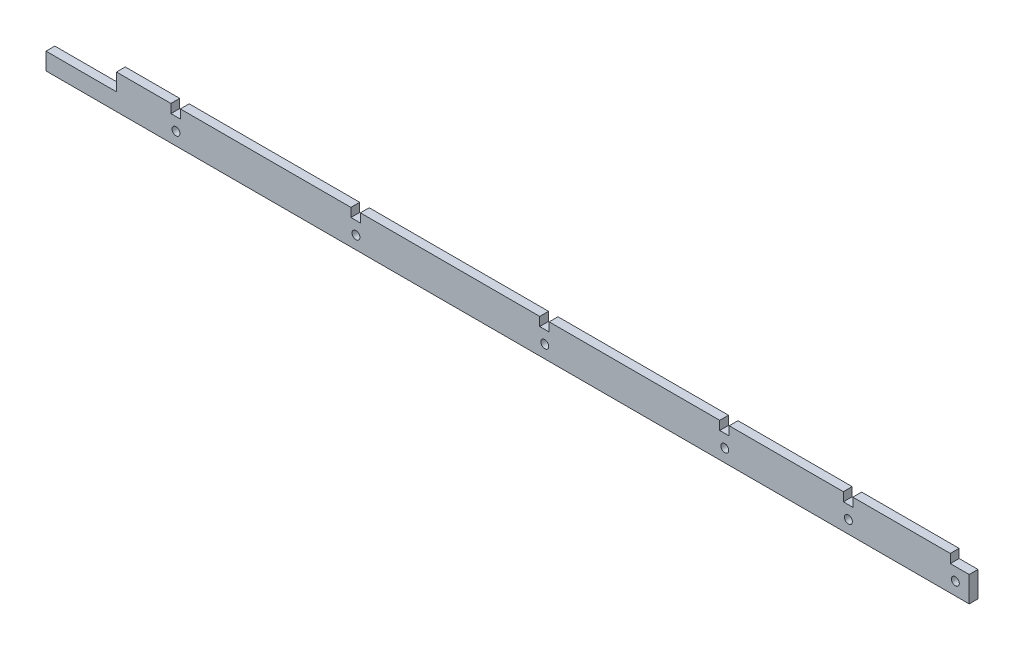
ISO-10303-21;
HEADER;
FILE_DESCRIPTION(('STEP AP214'),'2;1');
FILE_NAME('part.step','',(''),(''),'','','');
FILE_SCHEMA(('AUTOMOTIVE_DESIGN { 1 0 10303 214 1 1 1 1 }'));
ENDSEC;
DATA;
#1=APPLICATION_CONTEXT('core data for automotive mechanical design processes');
#2=APPLICATION_PROTOCOL_DEFINITION('international standard','automotive_design',2000,#1);
#3=PRODUCT_CONTEXT('',#1,'mechanical');
#4=PRODUCT('Part','Part','',(#3));
#5=PRODUCT_RELATED_PRODUCT_CATEGORY('part','',(#4));
#6=PRODUCT_DEFINITION_FORMATION('','',#4);
#7=PRODUCT_DEFINITION_CONTEXT('part definition',#1,'design');
#8=PRODUCT_DEFINITION('design','',#6,#7);
#9=PRODUCT_DEFINITION_SHAPE('','',#8);
#10=(LENGTH_UNIT() NAMED_UNIT(*) SI_UNIT(.MILLI.,.METRE.));
#11=(NAMED_UNIT(*) PLANE_ANGLE_UNIT() SI_UNIT($,.RADIAN.));
#12=(NAMED_UNIT(*) SI_UNIT($,.STERADIAN.) SOLID_ANGLE_UNIT());
#13=UNCERTAINTY_MEASURE_WITH_UNIT(LENGTH_MEASURE(1.E-05),#10,'distance_accuracy_value','');
#14=(GEOMETRIC_REPRESENTATION_CONTEXT(3) GLOBAL_UNCERTAINTY_ASSIGNED_CONTEXT((#13)) GLOBAL_UNIT_ASSIGNED_CONTEXT((#10,
#11,#12)) REPRESENTATION_CONTEXT('',''));
#15=CARTESIAN_POINT('',(0.,0.,0.));
#16=DIRECTION('',(0.,0.,1.));
#17=DIRECTION('',(1.,0.,0.));
#18=AXIS2_PLACEMENT_3D('',#15,#16,#17);
#19=CARTESIAN_POINT('',(0.,0.,3.175));
#20=DIRECTION('',(0.,0.,-1.));
#21=DIRECTION('',(-1.,0.,0.));
#22=AXIS2_PLACEMENT_3D('',#19,#20,#21);
#23=PLANE('',#22);
#24=CARTESIAN_POINT('',(6198.87205187686,2707.78643220183,3.175));
#25=DIRECTION('',(0.,0.,1.));
#26=DIRECTION('',(1.,0.,0.));
#27=AXIS2_PLACEMENT_3D('',#24,#25,#26);
#28=CIRCLE('',#27,1.42240000000005);
#29=CARTESIAN_POINT('',(6200.29445187686,2707.78643220183,3.175));
#30=VERTEX_POINT('',#29);
#31=EDGE_CURVE('E508',#30,#30,#28,.T.);
#32=ORIENTED_EDGE('',*,*,#31,.F.);
#33=EDGE_LOOP('',(#32));
#34=FACE_BOUND('',#33,.T.);
#35=CARTESIAN_POINT('',(6089.42149896098,2707.78643220184,3.175));
#36=DIRECTION('',(0.,0.,1.));
#37=DIRECTION('',(1.,0.,0.));
#38=AXIS2_PLACEMENT_3D('',#35,#36,#37);
#39=CIRCLE('',#38,1.42240000000005);
#40=CARTESIAN_POINT('',(6090.84389896098,2707.78643220184,3.175));
#41=VERTEX_POINT('',#40);
#42=EDGE_CURVE('E520',#41,#41,#39,.T.);
#43=ORIENTED_EDGE('',*,*,#42,.F.);
#44=EDGE_LOOP('',(#43));
#45=FACE_BOUND('',#44,.T.);
#46=CARTESIAN_POINT('',(5956.47789896098,2707.78643220183,3.175));
#47=DIRECTION('',(0.,0.,1.));
#48=DIRECTION('',(1.,0.,0.));
#49=AXIS2_PLACEMENT_3D('',#46,#47,#48);
#50=CIRCLE('',#49,1.42240000000005);
#51=CARTESIAN_POINT('',(5957.90029896098,2707.78643220183,3.175));
#52=VERTEX_POINT('',#51);
#53=EDGE_CURVE('E254',#52,#52,#50,.T.);
#54=ORIENTED_EDGE('',*,*,#53,.F.);
#55=EDGE_LOOP('',(#54));
#56=FACE_BOUND('',#55,.T.);
#57=DIRECTION('',(-1.,-1.30476322085459E-13,0.));
#58=VECTOR('',#57,1.);
#59=CARTESIAN_POINT('',(6242.41204896098,2712.38383220191,3.175));
#60=LINE('',#59,#58);
#61=CARTESIAN_POINT('',(6242.41204896098,2712.38383220191,3.175));
#62=VERTEX_POINT('',#61);
#63=CARTESIAN_POINT('',(6235.60484896098,2712.38383220191,3.175));
#64=VERTEX_POINT('',#63);
#65=EDGE_CURVE('E305',#62,#64,#60,.T.);
#66=ORIENTED_EDGE('',*,*,#65,.T.);
#67=DIRECTION('',(0.,1.,0.));
#68=VECTOR('',#67,1.);
#69=CARTESIAN_POINT('',(6235.60484896098,2712.38383220191,3.175));
#70=LINE('',#69,#68);
#71=CARTESIAN_POINT('',(6235.60484896098,2715.55883220183,3.175));
#72=VERTEX_POINT('',#71);
#73=EDGE_CURVE('E153',#64,#72,#70,.T.);
#74=ORIENTED_EDGE('',*,*,#73,.T.);
#75=DIRECTION('',(-1.,0.,0.));
#76=VECTOR('',#75,1.);
#77=CARTESIAN_POINT('',(6235.60484896098,2715.55883220183,3.175));
#78=LINE('',#77,#76);
#79=CARTESIAN_POINT('',(6200.45955187686,2715.55883220183,3.175));
#80=VERTEX_POINT('',#79);
#81=EDGE_CURVE('E380',#72,#80,#78,.T.);
#82=ORIENTED_EDGE('',*,*,#81,.T.);
#83=DIRECTION('',(0.,-1.,0.));
#84=VECTOR('',#83,1.);
#85=CARTESIAN_POINT('',(6200.45955187686,2715.55883220183,3.175));
#86=LINE('',#85,#84);
#87=CARTESIAN_POINT('',(6200.45955187686,2712.38383220191,3.175));
#88=VERTEX_POINT('',#87);
#89=EDGE_CURVE('E399',#80,#88,#86,.T.);
#90=ORIENTED_EDGE('',*,*,#89,.T.);
#91=DIRECTION('',(-1.,0.,0.));
#92=VECTOR('',#91,1.);
#93=CARTESIAN_POINT('',(6200.45955187686,2712.38383220191,3.175));
#94=LINE('',#93,#92);
#95=CARTESIAN_POINT('',(6197.05595187686,2712.38383220191,3.175));
#96=VERTEX_POINT('',#95);
#97=EDGE_CURVE('E396',#88,#96,#94,.T.);
#98=ORIENTED_EDGE('',*,*,#97,.T.);
#99=DIRECTION('',(-2.79741234557702E-13,1.,0.));
#100=VECTOR('',#99,1.);
#101=CARTESIAN_POINT('',(6197.05595187686,2715.55883220183,3.175));
#102=LINE('',#101,#100);
#103=CARTESIAN_POINT('',(6197.05595187686,2715.55883220183,3.175));
#104=VERTEX_POINT('',#103);
#105=EDGE_CURVE('E398',#96,#104,#102,.T.);
#106=ORIENTED_EDGE('',*,*,#105,.T.);
#107=DIRECTION('',(-1.,0.,0.));
#108=VECTOR('',#107,1.);
#109=CARTESIAN_POINT('',(6197.05595187686,2715.55883220183,3.175));
#110=LINE('',#109,#108);
#111=CARTESIAN_POINT('',(6155.89329896098,2715.55883220183,3.175));
#112=VERTEX_POINT('',#111);
#113=EDGE_CURVE('E401',#104,#112,#110,.T.);
#114=ORIENTED_EDGE('',*,*,#113,.T.);
#115=DIRECTION('',(2.79741234557272E-13,-1.,0.));
#116=VECTOR('',#115,1.);
#117=CARTESIAN_POINT('',(6155.89329896098,2715.55883220183,3.175));
#118=LINE('',#117,#116);
#119=CARTESIAN_POINT('',(6155.89329896098,2712.3838322019,3.175));
#120=VERTEX_POINT('',#119);
#121=EDGE_CURVE('E407',#112,#120,#118,.T.);
#122=ORIENTED_EDGE('',*,*,#121,.T.);
#123=DIRECTION('',(-1.,-1.30476322085408E-13,0.));
#124=VECTOR('',#123,1.);
#125=CARTESIAN_POINT('',(6155.89329896098,2712.3838322019,3.175));
#126=LINE('',#125,#124);
#127=CARTESIAN_POINT('',(6152.48969896098,2712.3838322019,3.175));
#128=VERTEX_POINT('',#127);
#129=EDGE_CURVE('E409',#120,#128,#126,.T.);
#130=ORIENTED_EDGE('',*,*,#129,.T.);
#131=DIRECTION('',(0.,1.,0.));
#132=VECTOR('',#131,1.);
#133=CARTESIAN_POINT('',(6152.48969896098,2715.55883220183,3.175));
#134=LINE('',#133,#132);
#135=CARTESIAN_POINT('',(6152.48969896098,2715.55883220183,3.175));
#136=VERTEX_POINT('',#135);
#137=EDGE_CURVE('E411',#128,#136,#134,.T.);
#138=ORIENTED_EDGE('',*,*,#137,.T.);
#139=DIRECTION('',(-1.,0.,0.));
#140=VECTOR('',#139,1.);
#141=CARTESIAN_POINT('',(6152.48969896098,2715.55883220183,3.175));
#142=LINE('',#141,#140);
#143=CARTESIAN_POINT('',(6091.00899896098,2715.55883220183,3.175));
#144=VERTEX_POINT('',#143);
#145=EDGE_CURVE('E413',#136,#144,#142,.T.);
#146=ORIENTED_EDGE('',*,*,#145,.T.);
#147=DIRECTION('',(0.,-1.,0.));
#148=VECTOR('',#147,1.);
#149=CARTESIAN_POINT('',(6091.00899896098,2715.55883220183,3.175));
#150=LINE('',#149,#148);
#151=CARTESIAN_POINT('',(6091.00899896098,2712.3838322019,3.175));
#152=VERTEX_POINT('',#151);
#153=EDGE_CURVE('E415',#144,#152,#150,.T.);
#154=ORIENTED_EDGE('',*,*,#153,.T.);
#155=DIRECTION('',(-1.,0.,0.));
#156=VECTOR('',#155,1.);
#157=CARTESIAN_POINT('',(6091.00899896098,2712.3838322019,3.175));
#158=LINE('',#157,#156);
#159=CARTESIAN_POINT('',(6087.60539896098,2712.3838322019,3.175));
#160=VERTEX_POINT('',#159);
#161=EDGE_CURVE('E417',#152,#160,#158,.T.);
#162=ORIENTED_EDGE('',*,*,#161,.T.);
#163=DIRECTION('',(-2.79741234556607E-13,1.,0.));
#164=VECTOR('',#163,1.);
#165=CARTESIAN_POINT('',(6087.60539896098,2715.55883220183,3.175));
#166=LINE('',#165,#164);
#167=CARTESIAN_POINT('',(6087.60539896098,2715.55883220183,3.175));
#168=VERTEX_POINT('',#167);
#169=EDGE_CURVE('E419',#160,#168,#166,.T.);
#170=ORIENTED_EDGE('',*,*,#169,.T.);
#171=DIRECTION('',(-1.,0.,0.));
#172=VECTOR('',#171,1.);
#173=CARTESIAN_POINT('',(6087.60539896098,2715.55883220183,3.175));
#174=LINE('',#173,#172);
#175=CARTESIAN_POINT('',(6022.94969896098,2715.55883220183,3.175));
#176=VERTEX_POINT('',#175);
#177=EDGE_CURVE('E421',#168,#176,#174,.T.);
#178=ORIENTED_EDGE('',*,*,#177,.T.);
#179=DIRECTION('',(0.,-1.,0.));
#180=VECTOR('',#179,1.);
#181=CARTESIAN_POINT('',(6022.94969896098,2715.55883220183,3.175));
#182=LINE('',#181,#180);
#183=CARTESIAN_POINT('',(6022.94969896098,2712.38383220189,3.175));
#184=VERTEX_POINT('',#183);
#185=EDGE_CURVE('E423',#176,#184,#182,.T.);
#186=ORIENTED_EDGE('',*,*,#185,.T.);
#187=DIRECTION('',(-1.,-1.30476322085442E-13,0.));
#188=VECTOR('',#187,1.);
#189=CARTESIAN_POINT('',(6022.94969896098,2712.38383220189,3.175));
#190=LINE('',#189,#188);
#191=CARTESIAN_POINT('',(6019.54609896098,2712.38383220189,3.175));
#192=VERTEX_POINT('',#191);
#193=EDGE_CURVE('E425',#184,#192,#190,.T.);
#194=ORIENTED_EDGE('',*,*,#193,.T.);
#195=DIRECTION('',(2.79741234555903E-13,1.,0.));
#196=VECTOR('',#195,1.);
#197=CARTESIAN_POINT('',(6019.54609896098,2715.55883220183,3.175));
#198=LINE('',#197,#196);
#199=CARTESIAN_POINT('',(6019.54609896098,2715.55883220183,3.175));
#200=VERTEX_POINT('',#199);
#201=EDGE_CURVE('E427',#192,#200,#198,.T.);
#202=ORIENTED_EDGE('',*,*,#201,.T.);
#203=DIRECTION('',(-1.,0.,0.));
#204=VECTOR('',#203,1.);
#205=CARTESIAN_POINT('',(6019.54609896098,2715.55883220183,3.175));
#206=LINE('',#205,#204);
#207=CARTESIAN_POINT('',(5958.06539896098,2715.55883220183,3.175));
#208=VERTEX_POINT('',#207);
#209=EDGE_CURVE('E429',#200,#208,#206,.T.);
#210=ORIENTED_EDGE('',*,*,#209,.T.);
#211=DIRECTION('',(0.,-1.,0.));
#212=VECTOR('',#211,1.);
#213=CARTESIAN_POINT('',(5958.06539896098,2715.55883220183,3.175));
#214=LINE('',#213,#212);
#215=CARTESIAN_POINT('',(5958.06539896098,2712.38383220188,3.175));
#216=VERTEX_POINT('',#215);
#217=EDGE_CURVE('E431',#208,#216,#214,.T.);
#218=ORIENTED_EDGE('',*,*,#217,.T.);
#219=DIRECTION('',(-1.,-1.30476322085442E-13,0.));
#220=VECTOR('',#219,1.);
#221=CARTESIAN_POINT('',(5958.06539896098,2712.38383220188,3.175));
#222=LINE('',#221,#220);
#223=CARTESIAN_POINT('',(5954.66179896098,2712.38383220188,3.175));
#224=VERTEX_POINT('',#223);
#225=EDGE_CURVE('E433',#216,#224,#222,.T.);
#226=ORIENTED_EDGE('',*,*,#225,.T.);
#227=DIRECTION('',(-2.79741234555277E-13,1.,0.));
#228=VECTOR('',#227,1.);
#229=CARTESIAN_POINT('',(5954.66179896098,2715.55883220183,3.175));
#230=LINE('',#229,#228);
#231=CARTESIAN_POINT('',(5954.66179896098,2715.55883220183,3.175));
#232=VERTEX_POINT('',#231);
#233=EDGE_CURVE('E435',#224,#232,#230,.T.);
#234=ORIENTED_EDGE('',*,*,#233,.T.);
#235=DIRECTION('',(-1.,0.,0.));
#236=VECTOR('',#235,1.);
#237=CARTESIAN_POINT('',(5954.66179896098,2715.55883220183,3.175));
#238=LINE('',#237,#236);
#239=CARTESIAN_POINT('',(5935.03394896098,2715.55883220183,3.175));
#240=VERTEX_POINT('',#239);
#241=EDGE_CURVE('E437',#232,#240,#238,.T.);
#242=ORIENTED_EDGE('',*,*,#241,.T.);
#243=DIRECTION('',(0.,-1.,0.));
#244=VECTOR('',#243,1.);
#245=CARTESIAN_POINT('',(5935.03394896098,2715.55883220183,3.175));
#246=LINE('',#245,#244);
#247=CARTESIAN_POINT('',(5935.03394896098,2709.37393220184,3.175));
#248=VERTEX_POINT('',#247);
#249=EDGE_CURVE('E439',#240,#248,#246,.T.);
#250=ORIENTED_EDGE('',*,*,#249,.T.);
#251=DIRECTION('',(-1.,0.,0.));
#252=VECTOR('',#251,1.);
#253=CARTESIAN_POINT('',(5909.63394896098,2709.37393220184,3.175));
#254=LINE('',#253,#252);
#255=CARTESIAN_POINT('',(5909.63394896098,2709.37393220184,3.175));
#256=VERTEX_POINT('',#255);
#257=EDGE_CURVE('E232',#248,#256,#254,.T.);
#258=ORIENTED_EDGE('',*,*,#257,.T.);
#259=DIRECTION('',(-1.43604329851796E-13,-1.,0.));
#260=VECTOR('',#259,1.);
#261=CARTESIAN_POINT('',(5909.63394896098,2709.37393220184,3.175));
#262=LINE('',#261,#260);
#263=CARTESIAN_POINT('',(5909.63394896098,2703.18903220184,3.175));
#264=VERTEX_POINT('',#263);
#265=EDGE_CURVE('E226',#256,#264,#262,.T.);
#266=ORIENTED_EDGE('',*,*,#265,.T.);
#267=DIRECTION('',(1.,0.,0.));
#268=VECTOR('',#267,1.);
#269=CARTESIAN_POINT('',(6242.41204896098,2703.18903220184,3.175));
#270=LINE('',#269,#268);
#271=CARTESIAN_POINT('',(6242.41204896098,2703.18903220184,3.175));
#272=VERTEX_POINT('',#271);
#273=EDGE_CURVE('E230',#264,#272,#270,.T.);
#274=ORIENTED_EDGE('',*,*,#273,.T.);
#275=DIRECTION('',(0.,1.,0.));
#276=VECTOR('',#275,1.);
#277=CARTESIAN_POINT('',(6242.41204896098,2703.18903220184,3.175));
#278=LINE('',#277,#276);
#279=EDGE_CURVE('E50',#272,#62,#278,.T.);
#280=ORIENTED_EDGE('',*,*,#279,.T.);
#281=EDGE_LOOP('',(#66,#74,#82,#90,#98,#106,#114,#122,#130,#138,#146,#154,#162,#170,#178,#186,
#194,#202,#210,#218,#226,#234,#242,#250,#258,#266,#274,#280));
#282=FACE_BOUND('',#281,.T.);
#283=CARTESIAN_POINT('',(6021.36219896098,2707.78643220184,3.175));
#284=DIRECTION('',(0.,0.,1.));
#285=DIRECTION('',(1.,0.,0.));
#286=AXIS2_PLACEMENT_3D('',#283,#284,#285);
#287=CIRCLE('',#286,1.42240000000005);
#288=CARTESIAN_POINT('',(6022.78459896098,2707.78643220184,3.175));
#289=VERTEX_POINT('',#288);
#290=EDGE_CURVE('E526',#289,#289,#287,.T.);
#291=ORIENTED_EDGE('',*,*,#290,.F.);
#292=EDGE_LOOP('',(#291));
#293=FACE_BOUND('',#292,.T.);
#294=CARTESIAN_POINT('',(6154.30579896098,2707.78643220183,3.175));
#295=DIRECTION('',(0.,0.,1.));
#296=DIRECTION('',(1.,0.,0.));
#297=AXIS2_PLACEMENT_3D('',#294,#295,#296);
#298=CIRCLE('',#297,1.42240000000005);
#299=CARTESIAN_POINT('',(6155.72819896098,2707.78643220183,3.175));
#300=VERTEX_POINT('',#299);
#301=EDGE_CURVE('E514',#300,#300,#298,.T.);
#302=ORIENTED_EDGE('',*,*,#301,.F.);
#303=EDGE_LOOP('',(#302));
#304=FACE_BOUND('',#303,.T.);
#305=CARTESIAN_POINT('',(6237.42094896098,2707.78643220183,3.175));
#306=DIRECTION('',(0.,0.,1.));
#307=DIRECTION('',(1.,0.,0.));
#308=AXIS2_PLACEMENT_3D('',#305,#306,#307);
#309=CIRCLE('',#308,1.42240000000005);
#310=CARTESIAN_POINT('',(6238.84334896098,2707.78643220183,3.175));
#311=VERTEX_POINT('',#310);
#312=EDGE_CURVE('E499',#311,#311,#309,.T.);
#313=ORIENTED_EDGE('',*,*,#312,.F.);
#314=EDGE_LOOP('',(#313));
#315=FACE_BOUND('',#314,.T.);
#316=ADVANCED_FACE('F33',(#34,#45,#56,#282,#293,#304,#315),#23,.F.);
#317=CARTESIAN_POINT('',(0.,0.,0.));
#318=DIRECTION('',(0.,0.,-1.));
#319=DIRECTION('',(-1.,0.,0.));
#320=AXIS2_PLACEMENT_3D('',#317,#318,#319);
#321=PLANE('',#320);
#322=CARTESIAN_POINT('',(6198.87205187686,2707.78643220183,0.));
#323=DIRECTION('',(0.,0.,1.));
#324=DIRECTION('',(1.,0.,0.));
#325=AXIS2_PLACEMENT_3D('',#322,#323,#324);
#326=CIRCLE('',#325,1.42240000000005);
#327=CARTESIAN_POINT('',(6200.29445187686,2707.78643220183,0.));
#328=VERTEX_POINT('',#327);
#329=EDGE_CURVE('E505',#328,#328,#326,.T.);
#330=ORIENTED_EDGE('',*,*,#329,.T.);
#331=EDGE_LOOP('',(#330));
#332=FACE_BOUND('',#331,.T.);
#333=CARTESIAN_POINT('',(6089.42149896098,2707.78643220184,0.));
#334=DIRECTION('',(0.,0.,1.));
#335=DIRECTION('',(1.,0.,0.));
#336=AXIS2_PLACEMENT_3D('',#333,#334,#335);
#337=CIRCLE('',#336,1.42240000000005);
#338=CARTESIAN_POINT('',(6090.84389896098,2707.78643220184,0.));
#339=VERTEX_POINT('',#338);
#340=EDGE_CURVE('E517',#339,#339,#337,.T.);
#341=ORIENTED_EDGE('',*,*,#340,.T.);
#342=EDGE_LOOP('',(#341));
#343=FACE_BOUND('',#342,.T.);
#344=CARTESIAN_POINT('',(5956.47789896098,2707.78643220183,0.));
#345=DIRECTION('',(0.,0.,1.));
#346=DIRECTION('',(1.,0.,0.));
#347=AXIS2_PLACEMENT_3D('',#344,#345,#346);
#348=CIRCLE('',#347,1.42240000000005);
#349=CARTESIAN_POINT('',(5957.90029896098,2707.78643220183,0.));
#350=VERTEX_POINT('',#349);
#351=EDGE_CURVE('E529',#350,#350,#348,.T.);
#352=ORIENTED_EDGE('',*,*,#351,.T.);
#353=EDGE_LOOP('',(#352));
#354=FACE_BOUND('',#353,.T.);
#355=DIRECTION('',(-1.,-1.30476322085459E-13,0.));
#356=VECTOR('',#355,1.);
#357=CARTESIAN_POINT('',(6242.41204896098,2712.38383220191,0.));
#358=LINE('',#357,#356);
#359=CARTESIAN_POINT('',(6242.41204896098,2712.38383220191,0.));
#360=VERTEX_POINT('',#359);
#361=CARTESIAN_POINT('',(6235.60484896098,2712.38383220191,0.));
#362=VERTEX_POINT('',#361);
#363=EDGE_CURVE('E250',#360,#362,#358,.T.);
#364=ORIENTED_EDGE('',*,*,#363,.F.);
#365=DIRECTION('',(0.,1.,0.));
#366=VECTOR('',#365,1.);
#367=CARTESIAN_POINT('',(6242.41204896098,2703.18903220184,0.));
#368=LINE('',#367,#366);
#369=CARTESIAN_POINT('',(6242.41204896098,2703.18903220184,0.));
#370=VERTEX_POINT('',#369);
#371=EDGE_CURVE('E145',#370,#360,#368,.T.);
#372=ORIENTED_EDGE('',*,*,#371,.F.);
#373=DIRECTION('',(1.,0.,0.));
#374=VECTOR('',#373,1.);
#375=CARTESIAN_POINT('',(6242.41204896098,2703.18903220184,0.));
#376=LINE('',#375,#374);
#377=CARTESIAN_POINT('',(5909.63394896098,2703.18903220184,0.));
#378=VERTEX_POINT('',#377);
#379=EDGE_CURVE('E139',#378,#370,#376,.T.);
#380=ORIENTED_EDGE('',*,*,#379,.F.);
#381=DIRECTION('',(-1.43604329851796E-13,-1.,0.));
#382=VECTOR('',#381,1.);
#383=CARTESIAN_POINT('',(5909.63394896098,2709.37393220184,0.));
#384=LINE('',#383,#382);
#385=CARTESIAN_POINT('',(5909.63394896098,2709.37393220184,0.));
#386=VERTEX_POINT('',#385);
#387=EDGE_CURVE('E240',#386,#378,#384,.T.);
#388=ORIENTED_EDGE('',*,*,#387,.F.);
#389=DIRECTION('',(-1.,0.,0.));
#390=VECTOR('',#389,1.);
#391=CARTESIAN_POINT('',(5909.63394896098,2709.37393220184,0.));
#392=LINE('',#391,#390);
#393=CARTESIAN_POINT('',(5935.03394896098,2709.37393220184,0.));
#394=VERTEX_POINT('',#393);
#395=EDGE_CURVE('E300',#394,#386,#392,.T.);
#396=ORIENTED_EDGE('',*,*,#395,.F.);
#397=DIRECTION('',(0.,-1.,0.));
#398=VECTOR('',#397,1.);
#399=CARTESIAN_POINT('',(5935.03394896098,2715.55883220183,0.));
#400=LINE('',#399,#398);
#401=CARTESIAN_POINT('',(5935.03394896098,2715.55883220183,0.));
#402=VERTEX_POINT('',#401);
#403=EDGE_CURVE('E298',#402,#394,#400,.T.);
#404=ORIENTED_EDGE('',*,*,#403,.F.);
#405=DIRECTION('',(-1.,0.,0.));
#406=VECTOR('',#405,1.);
#407=CARTESIAN_POINT('',(5954.66179896098,2715.55883220183,0.));
#408=LINE('',#407,#406);
#409=CARTESIAN_POINT('',(5954.66179896098,2715.55883220183,0.));
#410=VERTEX_POINT('',#409);
#411=EDGE_CURVE('E296',#410,#402,#408,.T.);
#412=ORIENTED_EDGE('',*,*,#411,.F.);
#413=DIRECTION('',(-2.79741234555277E-13,1.,0.));
#414=VECTOR('',#413,1.);
#415=CARTESIAN_POINT('',(5954.66179896098,2715.55883220183,0.));
#416=LINE('',#415,#414);
#417=CARTESIAN_POINT('',(5954.66179896098,2712.38383220188,0.));
#418=VERTEX_POINT('',#417);
#419=EDGE_CURVE('E294',#418,#410,#416,.T.);
#420=ORIENTED_EDGE('',*,*,#419,.F.);
#421=DIRECTION('',(-1.,-1.30476322085442E-13,0.));
#422=VECTOR('',#421,1.);
#423=CARTESIAN_POINT('',(5958.06539896098,2712.38383220188,0.));
#424=LINE('',#423,#422);
#425=CARTESIAN_POINT('',(5958.06539896098,2712.38383220188,0.));
#426=VERTEX_POINT('',#425);
#427=EDGE_CURVE('E292',#426,#418,#424,.T.);
#428=ORIENTED_EDGE('',*,*,#427,.F.);
#429=DIRECTION('',(0.,-1.,0.));
#430=VECTOR('',#429,1.);
#431=CARTESIAN_POINT('',(5958.06539896098,2715.55883220183,0.));
#432=LINE('',#431,#430);
#433=CARTESIAN_POINT('',(5958.06539896098,2715.55883220183,0.));
#434=VERTEX_POINT('',#433);
#435=EDGE_CURVE('E290',#434,#426,#432,.T.);
#436=ORIENTED_EDGE('',*,*,#435,.F.);
#437=DIRECTION('',(-1.,0.,0.));
#438=VECTOR('',#437,1.);
#439=CARTESIAN_POINT('',(6019.54609896098,2715.55883220183,0.));
#440=LINE('',#439,#438);
#441=CARTESIAN_POINT('',(6019.54609896098,2715.55883220183,0.));
#442=VERTEX_POINT('',#441);
#443=EDGE_CURVE('E288',#442,#434,#440,.T.);
#444=ORIENTED_EDGE('',*,*,#443,.F.);
#445=DIRECTION('',(2.79741234555903E-13,1.,0.));
#446=VECTOR('',#445,1.);
#447=CARTESIAN_POINT('',(6019.54609896098,2715.55883220183,0.));
#448=LINE('',#447,#446);
#449=CARTESIAN_POINT('',(6019.54609896098,2712.38383220189,0.));
#450=VERTEX_POINT('',#449);
#451=EDGE_CURVE('E286',#450,#442,#448,.T.);
#452=ORIENTED_EDGE('',*,*,#451,.F.);
#453=DIRECTION('',(-1.,-1.30476322085442E-13,0.));
#454=VECTOR('',#453,1.);
#455=CARTESIAN_POINT('',(6022.94969896098,2712.38383220189,0.));
#456=LINE('',#455,#454);
#457=CARTESIAN_POINT('',(6022.94969896098,2712.38383220189,0.));
#458=VERTEX_POINT('',#457);
#459=EDGE_CURVE('E284',#458,#450,#456,.T.);
#460=ORIENTED_EDGE('',*,*,#459,.F.);
#461=DIRECTION('',(0.,-1.,0.));
#462=VECTOR('',#461,1.);
#463=CARTESIAN_POINT('',(6022.94969896098,2715.55883220183,0.));
#464=LINE('',#463,#462);
#465=CARTESIAN_POINT('',(6022.94969896098,2715.55883220183,0.));
#466=VERTEX_POINT('',#465);
#467=EDGE_CURVE('E282',#466,#458,#464,.T.);
#468=ORIENTED_EDGE('',*,*,#467,.F.);
#469=DIRECTION('',(-1.,0.,0.));
#470=VECTOR('',#469,1.);
#471=CARTESIAN_POINT('',(6087.60539896098,2715.55883220183,0.));
#472=LINE('',#471,#470);
#473=CARTESIAN_POINT('',(6087.60539896098,2715.55883220183,0.));
#474=VERTEX_POINT('',#473);
#475=EDGE_CURVE('E280',#474,#466,#472,.T.);
#476=ORIENTED_EDGE('',*,*,#475,.F.);
#477=DIRECTION('',(-2.79741234556607E-13,1.,0.));
#478=VECTOR('',#477,1.);
#479=CARTESIAN_POINT('',(6087.60539896098,2715.55883220183,0.));
#480=LINE('',#479,#478);
#481=CARTESIAN_POINT('',(6087.60539896098,2712.3838322019,0.));
#482=VERTEX_POINT('',#481);
#483=EDGE_CURVE('E278',#482,#474,#480,.T.);
#484=ORIENTED_EDGE('',*,*,#483,.F.);
#485=DIRECTION('',(-1.,0.,0.));
#486=VECTOR('',#485,1.);
#487=CARTESIAN_POINT('',(6091.00899896098,2712.3838322019,0.));
#488=LINE('',#487,#486);
#489=CARTESIAN_POINT('',(6091.00899896098,2712.3838322019,0.));
#490=VERTEX_POINT('',#489);
#491=EDGE_CURVE('E276',#490,#482,#488,.T.);
#492=ORIENTED_EDGE('',*,*,#491,.F.);
#493=DIRECTION('',(0.,-1.,0.));
#494=VECTOR('',#493,1.);
#495=CARTESIAN_POINT('',(6091.00899896098,2715.55883220183,0.));
#496=LINE('',#495,#494);
#497=CARTESIAN_POINT('',(6091.00899896098,2715.55883220183,0.));
#498=VERTEX_POINT('',#497);
#499=EDGE_CURVE('E274',#498,#490,#496,.T.);
#500=ORIENTED_EDGE('',*,*,#499,.F.);
#501=DIRECTION('',(-1.,0.,0.));
#502=VECTOR('',#501,1.);
#503=CARTESIAN_POINT('',(6152.48969896098,2715.55883220183,0.));
#504=LINE('',#503,#502);
#505=CARTESIAN_POINT('',(6152.48969896098,2715.55883220183,0.));
#506=VERTEX_POINT('',#505);
#507=EDGE_CURVE('E272',#506,#498,#504,.T.);
#508=ORIENTED_EDGE('',*,*,#507,.F.);
#509=DIRECTION('',(0.,1.,0.));
#510=VECTOR('',#509,1.);
#511=CARTESIAN_POINT('',(6152.48969896098,2715.55883220183,0.));
#512=LINE('',#511,#510);
#513=CARTESIAN_POINT('',(6152.48969896098,2712.3838322019,0.));
#514=VERTEX_POINT('',#513);
#515=EDGE_CURVE('E270',#514,#506,#512,.T.);
#516=ORIENTED_EDGE('',*,*,#515,.F.);
#517=DIRECTION('',(-1.,-1.30476322085408E-13,0.));
#518=VECTOR('',#517,1.);
#519=CARTESIAN_POINT('',(6155.89329896098,2712.3838322019,0.));
#520=LINE('',#519,#518);
#521=CARTESIAN_POINT('',(6155.89329896098,2712.3838322019,0.));
#522=VERTEX_POINT('',#521);
#523=EDGE_CURVE('E268',#522,#514,#520,.T.);
#524=ORIENTED_EDGE('',*,*,#523,.F.);
#525=DIRECTION('',(2.79741234557272E-13,-1.,0.));
#526=VECTOR('',#525,1.);
#527=CARTESIAN_POINT('',(6155.89329896098,2715.55883220183,0.));
#528=LINE('',#527,#526);
#529=CARTESIAN_POINT('',(6155.89329896098,2715.55883220183,0.));
#530=VERTEX_POINT('',#529);
#531=EDGE_CURVE('E266',#530,#522,#528,.T.);
#532=ORIENTED_EDGE('',*,*,#531,.F.);
#533=DIRECTION('',(-1.,0.,0.));
#534=VECTOR('',#533,1.);
#535=CARTESIAN_POINT('',(6197.05595187686,2715.55883220183,0.));
#536=LINE('',#535,#534);
#537=CARTESIAN_POINT('',(6197.05595187686,2715.55883220183,0.));
#538=VERTEX_POINT('',#537);
#539=EDGE_CURVE('E264',#538,#530,#536,.T.);
#540=ORIENTED_EDGE('',*,*,#539,.F.);
#541=DIRECTION('',(-2.79741234557702E-13,1.,0.));
#542=VECTOR('',#541,1.);
#543=CARTESIAN_POINT('',(6197.05595187686,2715.55883220183,0.));
#544=LINE('',#543,#542);
#545=CARTESIAN_POINT('',(6197.05595187686,2712.38383220191,0.));
#546=VERTEX_POINT('',#545);
#547=EDGE_CURVE('E262',#546,#538,#544,.T.);
#548=ORIENTED_EDGE('',*,*,#547,.F.);
#549=DIRECTION('',(-1.,0.,0.));
#550=VECTOR('',#549,1.);
#551=CARTESIAN_POINT('',(6200.45955187686,2712.38383220191,0.));
#552=LINE('',#551,#550);
#553=CARTESIAN_POINT('',(6200.45955187686,2712.38383220191,0.));
#554=VERTEX_POINT('',#553);
#555=EDGE_CURVE('E260',#554,#546,#552,.T.);
#556=ORIENTED_EDGE('',*,*,#555,.F.);
#557=DIRECTION('',(0.,-1.,0.));
#558=VECTOR('',#557,1.);
#559=CARTESIAN_POINT('',(6200.45955187686,2715.55883220183,0.));
#560=LINE('',#559,#558);
#561=CARTESIAN_POINT('',(6200.45955187686,2715.55883220183,0.));
#562=VERTEX_POINT('',#561);
#563=EDGE_CURVE('E258',#562,#554,#560,.T.);
#564=ORIENTED_EDGE('',*,*,#563,.F.);
#565=DIRECTION('',(-1.,0.,0.));
#566=VECTOR('',#565,1.);
#567=CARTESIAN_POINT('',(6235.60484896098,2715.55883220183,0.));
#568=LINE('',#567,#566);
#569=CARTESIAN_POINT('',(6235.60484896098,2715.55883220183,0.));
#570=VERTEX_POINT('',#569);
#571=EDGE_CURVE('E256',#570,#562,#568,.T.);
#572=ORIENTED_EDGE('',*,*,#571,.F.);
#573=DIRECTION('',(0.,1.,0.));
#574=VECTOR('',#573,1.);
#575=CARTESIAN_POINT('',(6235.60484896098,2712.38383220191,0.));
#576=LINE('',#575,#574);
#577=EDGE_CURVE('E253',#362,#570,#576,.T.);
#578=ORIENTED_EDGE('',*,*,#577,.F.);
#579=EDGE_LOOP('',(#364,#372,#380,#388,#396,#404,#412,#420,#428,#436,#444,#452,#460,#468,#476,
#484,#492,#500,#508,#516,#524,#532,#540,#548,#556,#564,#572,#578));
#580=FACE_BOUND('',#579,.T.);
#581=CARTESIAN_POINT('',(6021.36219896098,2707.78643220184,0.));
#582=DIRECTION('',(0.,0.,1.));
#583=DIRECTION('',(1.,0.,0.));
#584=AXIS2_PLACEMENT_3D('',#581,#582,#583);
#585=CIRCLE('',#584,1.42240000000005);
#586=CARTESIAN_POINT('',(6022.78459896098,2707.78643220184,0.));
#587=VERTEX_POINT('',#586);
#588=EDGE_CURVE('E523',#587,#587,#585,.T.);
#589=ORIENTED_EDGE('',*,*,#588,.T.);
#590=EDGE_LOOP('',(#589));
#591=FACE_BOUND('',#590,.T.);
#592=CARTESIAN_POINT('',(6154.30579896098,2707.78643220183,0.));
#593=DIRECTION('',(0.,0.,1.));
#594=DIRECTION('',(1.,0.,0.));
#595=AXIS2_PLACEMENT_3D('',#592,#593,#594);
#596=CIRCLE('',#595,1.42240000000005);
#597=CARTESIAN_POINT('',(6155.72819896098,2707.78643220183,0.));
#598=VERTEX_POINT('',#597);
#599=EDGE_CURVE('E511',#598,#598,#596,.T.);
#600=ORIENTED_EDGE('',*,*,#599,.T.);
#601=EDGE_LOOP('',(#600));
#602=FACE_BOUND('',#601,.T.);
#603=CARTESIAN_POINT('',(6237.42094896098,2707.78643220183,0.));
#604=DIRECTION('',(0.,0.,1.));
#605=DIRECTION('',(1.,0.,0.));
#606=AXIS2_PLACEMENT_3D('',#603,#604,#605);
#607=CIRCLE('',#606,1.42240000000005);
#608=CARTESIAN_POINT('',(6238.84334896098,2707.78643220183,0.));
#609=VERTEX_POINT('',#608);
#610=EDGE_CURVE('E502',#609,#609,#607,.T.);
#611=ORIENTED_EDGE('',*,*,#610,.T.);
#612=EDGE_LOOP('',(#611));
#613=FACE_BOUND('',#612,.T.);
#614=ADVANCED_FACE('F384',(#332,#343,#354,#580,#591,#602,#613),#321,.T.);
#615=CARTESIAN_POINT('',(6242.41204896098,2712.38383220191,3.175));
#616=DIRECTION('',(1.30476322085459E-13,-1.,0.));
#617=DIRECTION('',(1.,1.30476322085459E-13,0.));
#618=AXIS2_PLACEMENT_3D('',#615,#616,#617);
#619=PLANE('',#618);
#620=ORIENTED_EDGE('',*,*,#363,.T.);
#621=DIRECTION('',(0.,0.,-1.));
#622=VECTOR('',#621,1.);
#623=CARTESIAN_POINT('',(6235.60484896098,2712.38383220191,3.175));
#624=LINE('',#623,#622);
#625=EDGE_CURVE('E11',#64,#362,#624,.T.);
#626=ORIENTED_EDGE('',*,*,#625,.F.);
#627=ORIENTED_EDGE('',*,*,#65,.F.);
#628=DIRECTION('',(0.,0.,-1.));
#629=VECTOR('',#628,1.);
#630=CARTESIAN_POINT('',(6242.41204896098,2712.38383220191,3.175));
#631=LINE('',#630,#629);
#632=EDGE_CURVE('E246',#62,#360,#631,.T.);
#633=ORIENTED_EDGE('',*,*,#632,.T.);
#634=EDGE_LOOP('',(#620,#626,#627,#633));
#635=FACE_BOUND('',#634,.T.);
#636=ADVANCED_FACE('F35',(#635),#619,.F.);
#637=CARTESIAN_POINT('',(6235.60484896098,2712.38383220191,3.175));
#638=DIRECTION('',(-1.,0.,0.));
#639=DIRECTION('',(0.,0.,1.));
#640=AXIS2_PLACEMENT_3D('',#637,#638,#639);
#641=PLANE('',#640);
#642=ORIENTED_EDGE('',*,*,#577,.T.);
#643=DIRECTION('',(0.,0.,-1.));
#644=VECTOR('',#643,1.);
#645=CARTESIAN_POINT('',(6235.60484896098,2715.55883220183,3.175));
#646=LINE('',#645,#644);
#647=EDGE_CURVE('E42',#72,#570,#646,.T.);
#648=ORIENTED_EDGE('',*,*,#647,.F.);
#649=ORIENTED_EDGE('',*,*,#73,.F.);
#650=ORIENTED_EDGE('',*,*,#625,.T.);
#651=EDGE_LOOP('',(#642,#648,#649,#650));
#652=FACE_BOUND('',#651,.T.);
#653=ADVANCED_FACE('F816',(#652),#641,.F.);
#654=CARTESIAN_POINT('',(6235.60484896098,2715.55883220183,3.175));
#655=DIRECTION('',(0.,-1.,0.));
#656=DIRECTION('',(1.,0.,0.));
#657=AXIS2_PLACEMENT_3D('',#654,#655,#656);
#658=PLANE('',#657);
#659=ORIENTED_EDGE('',*,*,#571,.T.);
#660=DIRECTION('',(0.,0.,-1.));
#661=VECTOR('',#660,1.);
#662=CARTESIAN_POINT('',(6200.45955187686,2715.55883220183,3.175));
#663=LINE('',#662,#661);
#664=EDGE_CURVE('E372',#80,#562,#663,.T.);
#665=ORIENTED_EDGE('',*,*,#664,.F.);
#666=ORIENTED_EDGE('',*,*,#81,.F.);
#667=ORIENTED_EDGE('',*,*,#647,.T.);
#668=EDGE_LOOP('',(#659,#665,#666,#667));
#669=FACE_BOUND('',#668,.T.);
#670=ADVANCED_FACE('F378',(#669),#658,.F.);
#671=CARTESIAN_POINT('',(6200.45955187686,2715.55883220183,3.175));
#672=DIRECTION('',(1.,0.,0.));
#673=DIRECTION('',(0.,0.,-1.));
#674=AXIS2_PLACEMENT_3D('',#671,#672,#673);
#675=PLANE('',#674);
#676=ORIENTED_EDGE('',*,*,#563,.T.);
#677=DIRECTION('',(0.,0.,-1.));
#678=VECTOR('',#677,1.);
#679=CARTESIAN_POINT('',(6200.45955187686,2712.38383220191,3.175));
#680=LINE('',#679,#678);
#681=EDGE_CURVE('E369',#88,#554,#680,.T.);
#682=ORIENTED_EDGE('',*,*,#681,.F.);
#683=ORIENTED_EDGE('',*,*,#89,.F.);
#684=ORIENTED_EDGE('',*,*,#664,.T.);
#685=EDGE_LOOP('',(#676,#682,#683,#684));
#686=FACE_BOUND('',#685,.T.);
#687=ADVANCED_FACE('F390',(#686),#675,.F.);
#688=CARTESIAN_POINT('',(6200.45955187686,2712.38383220191,3.175));
#689=DIRECTION('',(0.,-1.,0.));
#690=DIRECTION('',(0.,0.,-1.));
#691=AXIS2_PLACEMENT_3D('',#688,#689,#690);
#692=PLANE('',#691);
#693=ORIENTED_EDGE('',*,*,#555,.T.);
#694=DIRECTION('',(0.,0.,-1.));
#695=VECTOR('',#694,1.);
#696=CARTESIAN_POINT('',(6197.05595187686,2712.38383220191,3.175));
#697=LINE('',#696,#695);
#698=EDGE_CURVE('E366',#96,#546,#697,.T.);
#699=ORIENTED_EDGE('',*,*,#698,.F.);
#700=ORIENTED_EDGE('',*,*,#97,.F.);
#701=ORIENTED_EDGE('',*,*,#681,.T.);
#702=EDGE_LOOP('',(#693,#699,#700,#701));
#703=FACE_BOUND('',#702,.T.);
#704=ADVANCED_FACE('F394',(#703),#692,.F.);
#705=CARTESIAN_POINT('',(6197.05595187686,2715.55883220183,3.175));
#706=DIRECTION('',(-1.,-2.79741234557703E-13,0.));
#707=DIRECTION('',(2.79741234557703E-13,-1.,0.));
#708=AXIS2_PLACEMENT_3D('',#705,#706,#707);
#709=PLANE('',#708);
#710=ORIENTED_EDGE('',*,*,#547,.T.);
#711=DIRECTION('',(0.,0.,-1.));
#712=VECTOR('',#711,1.);
#713=CARTESIAN_POINT('',(6197.05595187686,2715.55883220183,3.175));
#714=LINE('',#713,#712);
#715=EDGE_CURVE('E363',#104,#538,#714,.T.);
#716=ORIENTED_EDGE('',*,*,#715,.F.);
#717=ORIENTED_EDGE('',*,*,#105,.F.);
#718=ORIENTED_EDGE('',*,*,#698,.T.);
#719=EDGE_LOOP('',(#710,#716,#717,#718));
#720=FACE_BOUND('',#719,.T.);
#721=ADVANCED_FACE('F781',(#720),#709,.F.);
#722=CARTESIAN_POINT('',(6197.05595187686,2715.55883220183,3.175));
#723=DIRECTION('',(0.,-1.,0.));
#724=DIRECTION('',(0.,0.,-1.));
#725=AXIS2_PLACEMENT_3D('',#722,#723,#724);
#726=PLANE('',#725);
#727=ORIENTED_EDGE('',*,*,#539,.T.);
#728=DIRECTION('',(0.,0.,-1.));
#729=VECTOR('',#728,1.);
#730=CARTESIAN_POINT('',(6155.89329896098,2715.55883220183,3.175));
#731=LINE('',#730,#729);
#732=EDGE_CURVE('E360',#112,#530,#731,.T.);
#733=ORIENTED_EDGE('',*,*,#732,.F.);
#734=ORIENTED_EDGE('',*,*,#113,.F.);
#735=ORIENTED_EDGE('',*,*,#715,.T.);
#736=EDGE_LOOP('',(#727,#733,#734,#735));
#737=FACE_BOUND('',#736,.T.);
#738=ADVANCED_FACE('F771',(#737),#726,.F.);
#739=CARTESIAN_POINT('',(6155.89329896098,2715.55883220183,3.175));
#740=DIRECTION('',(1.,2.79741234557272E-13,0.));
#741=DIRECTION('',(-2.79741234557272E-13,1.,0.));
#742=AXIS2_PLACEMENT_3D('',#739,#740,#741);
#743=PLANE('',#742);
#744=ORIENTED_EDGE('',*,*,#531,.T.);
#745=DIRECTION('',(0.,0.,-1.));
#746=VECTOR('',#745,1.);
#747=CARTESIAN_POINT('',(6155.89329896098,2712.3838322019,3.175));
#748=LINE('',#747,#746);
#749=EDGE_CURVE('E357',#120,#522,#748,.T.);
#750=ORIENTED_EDGE('',*,*,#749,.F.);
#751=ORIENTED_EDGE('',*,*,#121,.F.);
#752=ORIENTED_EDGE('',*,*,#732,.T.);
#753=EDGE_LOOP('',(#744,#750,#751,#752));
#754=FACE_BOUND('',#753,.T.);
#755=ADVANCED_FACE('F761',(#754),#743,.F.);
#756=CARTESIAN_POINT('',(6155.89329896098,2712.3838322019,3.175));
#757=DIRECTION('',(1.30476322085408E-13,-1.,0.));
#758=DIRECTION('',(1.,1.30476322085408E-13,0.));
#759=AXIS2_PLACEMENT_3D('',#756,#757,#758);
#760=PLANE('',#759);
#761=ORIENTED_EDGE('',*,*,#523,.T.);
#762=DIRECTION('',(0.,0.,-1.));
#763=VECTOR('',#762,1.);
#764=CARTESIAN_POINT('',(6152.48969896098,2712.3838322019,3.175));
#765=LINE('',#764,#763);
#766=EDGE_CURVE('E354',#128,#514,#765,.T.);
#767=ORIENTED_EDGE('',*,*,#766,.F.);
#768=ORIENTED_EDGE('',*,*,#129,.F.);
#769=ORIENTED_EDGE('',*,*,#749,.T.);
#770=EDGE_LOOP('',(#761,#767,#768,#769));
#771=FACE_BOUND('',#770,.T.);
#772=ADVANCED_FACE('F751',(#771),#760,.F.);
#773=CARTESIAN_POINT('',(6152.48969896098,2715.55883220183,3.175));
#774=DIRECTION('',(-1.,0.,0.));
#775=DIRECTION('',(0.,0.,1.));
#776=AXIS2_PLACEMENT_3D('',#773,#774,#775);
#777=PLANE('',#776);
#778=ORIENTED_EDGE('',*,*,#515,.T.);
#779=DIRECTION('',(0.,0.,-1.));
#780=VECTOR('',#779,1.);
#781=CARTESIAN_POINT('',(6152.48969896098,2715.55883220183,3.175));
#782=LINE('',#781,#780);
#783=EDGE_CURVE('E351',#136,#506,#782,.T.);
#784=ORIENTED_EDGE('',*,*,#783,.F.);
#785=ORIENTED_EDGE('',*,*,#137,.F.);
#786=ORIENTED_EDGE('',*,*,#766,.T.);
#787=EDGE_LOOP('',(#778,#784,#785,#786));
#788=FACE_BOUND('',#787,.T.);
#789=ADVANCED_FACE('F741',(#788),#777,.F.);
#790=CARTESIAN_POINT('',(6152.48969896098,2715.55883220183,3.175));
#791=DIRECTION('',(0.,-1.,0.));
#792=DIRECTION('',(1.,0.,0.));
#793=AXIS2_PLACEMENT_3D('',#790,#791,#792);
#794=PLANE('',#793);
#795=ORIENTED_EDGE('',*,*,#507,.T.);
#796=DIRECTION('',(0.,0.,-1.));
#797=VECTOR('',#796,1.);
#798=CARTESIAN_POINT('',(6091.00899896098,2715.55883220183,3.175));
#799=LINE('',#798,#797);
#800=EDGE_CURVE('E348',#144,#498,#799,.T.);
#801=ORIENTED_EDGE('',*,*,#800,.F.);
#802=ORIENTED_EDGE('',*,*,#145,.F.);
#803=ORIENTED_EDGE('',*,*,#783,.T.);
#804=EDGE_LOOP('',(#795,#801,#802,#803));
#805=FACE_BOUND('',#804,.T.);
#806=ADVANCED_FACE('F731',(#805),#794,.F.);
#807=CARTESIAN_POINT('',(6091.00899896098,2715.55883220183,3.175));
#808=DIRECTION('',(1.,0.,0.));
#809=DIRECTION('',(0.,0.,-1.));
#810=AXIS2_PLACEMENT_3D('',#807,#808,#809);
#811=PLANE('',#810);
#812=ORIENTED_EDGE('',*,*,#499,.T.);
#813=DIRECTION('',(0.,0.,-1.));
#814=VECTOR('',#813,1.);
#815=CARTESIAN_POINT('',(6091.00899896098,2712.3838322019,3.175));
#816=LINE('',#815,#814);
#817=EDGE_CURVE('E345',#152,#490,#816,.T.);
#818=ORIENTED_EDGE('',*,*,#817,.F.);
#819=ORIENTED_EDGE('',*,*,#153,.F.);
#820=ORIENTED_EDGE('',*,*,#800,.T.);
#821=EDGE_LOOP('',(#812,#818,#819,#820));
#822=FACE_BOUND('',#821,.T.);
#823=ADVANCED_FACE('F721',(#822),#811,.F.);
#824=CARTESIAN_POINT('',(6091.00899896098,2712.3838322019,3.175));
#825=DIRECTION('',(0.,-1.,0.));
#826=DIRECTION('',(0.,0.,-1.));
#827=AXIS2_PLACEMENT_3D('',#824,#825,#826);
#828=PLANE('',#827);
#829=ORIENTED_EDGE('',*,*,#491,.T.);
#830=DIRECTION('',(0.,0.,-1.));
#831=VECTOR('',#830,1.);
#832=CARTESIAN_POINT('',(6087.60539896098,2712.3838322019,3.175));
#833=LINE('',#832,#831);
#834=EDGE_CURVE('E342',#160,#482,#833,.T.);
#835=ORIENTED_EDGE('',*,*,#834,.F.);
#836=ORIENTED_EDGE('',*,*,#161,.F.);
#837=ORIENTED_EDGE('',*,*,#817,.T.);
#838=EDGE_LOOP('',(#829,#835,#836,#837));
#839=FACE_BOUND('',#838,.T.);
#840=ADVANCED_FACE('F711',(#839),#828,.F.);
#841=CARTESIAN_POINT('',(6087.60539896098,2715.55883220183,3.175));
#842=DIRECTION('',(-1.,-2.79741234556607E-13,0.));
#843=DIRECTION('',(2.79741234556607E-13,-1.,0.));
#844=AXIS2_PLACEMENT_3D('',#841,#842,#843);
#845=PLANE('',#844);
#846=ORIENTED_EDGE('',*,*,#483,.T.);
#847=DIRECTION('',(0.,0.,-1.));
#848=VECTOR('',#847,1.);
#849=CARTESIAN_POINT('',(6087.60539896098,2715.55883220183,3.175));
#850=LINE('',#849,#848);
#851=EDGE_CURVE('E339',#168,#474,#850,.T.);
#852=ORIENTED_EDGE('',*,*,#851,.F.);
#853=ORIENTED_EDGE('',*,*,#169,.F.);
#854=ORIENTED_EDGE('',*,*,#834,.T.);
#855=EDGE_LOOP('',(#846,#852,#853,#854));
#856=FACE_BOUND('',#855,.T.);
#857=ADVANCED_FACE('F701',(#856),#845,.F.);
#858=CARTESIAN_POINT('',(6087.60539896098,2715.55883220183,3.175));
#859=DIRECTION('',(0.,-1.,0.));
#860=DIRECTION('',(0.,0.,-1.));
#861=AXIS2_PLACEMENT_3D('',#858,#859,#860);
#862=PLANE('',#861);
#863=ORIENTED_EDGE('',*,*,#475,.T.);
#864=DIRECTION('',(0.,0.,-1.));
#865=VECTOR('',#864,1.);
#866=CARTESIAN_POINT('',(6022.94969896098,2715.55883220183,3.175));
#867=LINE('',#866,#865);
#868=EDGE_CURVE('E336',#176,#466,#867,.T.);
#869=ORIENTED_EDGE('',*,*,#868,.F.);
#870=ORIENTED_EDGE('',*,*,#177,.F.);
#871=ORIENTED_EDGE('',*,*,#851,.T.);
#872=EDGE_LOOP('',(#863,#869,#870,#871));
#873=FACE_BOUND('',#872,.T.);
#874=ADVANCED_FACE('F691',(#873),#862,.F.);
#875=CARTESIAN_POINT('',(6022.94969896098,2715.55883220183,3.175));
#876=DIRECTION('',(1.,0.,0.));
#877=DIRECTION('',(0.,0.,-1.));
#878=AXIS2_PLACEMENT_3D('',#875,#876,#877);
#879=PLANE('',#878);
#880=ORIENTED_EDGE('',*,*,#467,.T.);
#881=DIRECTION('',(0.,0.,-1.));
#882=VECTOR('',#881,1.);
#883=CARTESIAN_POINT('',(6022.94969896098,2712.38383220189,3.175));
#884=LINE('',#883,#882);
#885=EDGE_CURVE('E333',#184,#458,#884,.T.);
#886=ORIENTED_EDGE('',*,*,#885,.F.);
#887=ORIENTED_EDGE('',*,*,#185,.F.);
#888=ORIENTED_EDGE('',*,*,#868,.T.);
#889=EDGE_LOOP('',(#880,#886,#887,#888));
#890=FACE_BOUND('',#889,.T.);
#891=ADVANCED_FACE('F681',(#890),#879,.F.);
#892=CARTESIAN_POINT('',(6022.94969896098,2712.38383220189,3.175));
#893=DIRECTION('',(1.30476322085442E-13,-1.,0.));
#894=DIRECTION('',(1.,1.30476322085442E-13,0.));
#895=AXIS2_PLACEMENT_3D('',#892,#893,#894);
#896=PLANE('',#895);
#897=ORIENTED_EDGE('',*,*,#459,.T.);
#898=DIRECTION('',(0.,0.,-1.));
#899=VECTOR('',#898,1.);
#900=CARTESIAN_POINT('',(6019.54609896098,2712.38383220189,3.175));
#901=LINE('',#900,#899);
#902=EDGE_CURVE('E330',#192,#450,#901,.T.);
#903=ORIENTED_EDGE('',*,*,#902,.F.);
#904=ORIENTED_EDGE('',*,*,#193,.F.);
#905=ORIENTED_EDGE('',*,*,#885,.T.);
#906=EDGE_LOOP('',(#897,#903,#904,#905));
#907=FACE_BOUND('',#906,.T.);
#908=ADVANCED_FACE('F671',(#907),#896,.F.);
#909=CARTESIAN_POINT('',(6019.54609896098,2715.55883220183,3.175));
#910=DIRECTION('',(-1.,2.79741234555903E-13,0.));
#911=DIRECTION('',(-2.79741234555903E-13,-1.,0.));
#912=AXIS2_PLACEMENT_3D('',#909,#910,#911);
#913=PLANE('',#912);
#914=ORIENTED_EDGE('',*,*,#451,.T.);
#915=DIRECTION('',(0.,0.,-1.));
#916=VECTOR('',#915,1.);
#917=CARTESIAN_POINT('',(6019.54609896098,2715.55883220183,3.175));
#918=LINE('',#917,#916);
#919=EDGE_CURVE('E327',#200,#442,#918,.T.);
#920=ORIENTED_EDGE('',*,*,#919,.F.);
#921=ORIENTED_EDGE('',*,*,#201,.F.);
#922=ORIENTED_EDGE('',*,*,#902,.T.);
#923=EDGE_LOOP('',(#914,#920,#921,#922));
#924=FACE_BOUND('',#923,.T.);
#925=ADVANCED_FACE('F661',(#924),#913,.F.);
#926=CARTESIAN_POINT('',(6019.54609896098,2715.55883220183,3.175));
#927=DIRECTION('',(0.,-1.,0.));
#928=DIRECTION('',(1.,0.,0.));
#929=AXIS2_PLACEMENT_3D('',#926,#927,#928);
#930=PLANE('',#929);
#931=ORIENTED_EDGE('',*,*,#443,.T.);
#932=DIRECTION('',(0.,0.,-1.));
#933=VECTOR('',#932,1.);
#934=CARTESIAN_POINT('',(5958.06539896098,2715.55883220183,3.175));
#935=LINE('',#934,#933);
#936=EDGE_CURVE('E324',#208,#434,#935,.T.);
#937=ORIENTED_EDGE('',*,*,#936,.F.);
#938=ORIENTED_EDGE('',*,*,#209,.F.);
#939=ORIENTED_EDGE('',*,*,#919,.T.);
#940=EDGE_LOOP('',(#931,#937,#938,#939));
#941=FACE_BOUND('',#940,.T.);
#942=ADVANCED_FACE('F651',(#941),#930,.F.);
#943=CARTESIAN_POINT('',(5958.06539896098,2715.55883220183,3.175));
#944=DIRECTION('',(1.,0.,0.));
#945=DIRECTION('',(0.,0.,-1.));
#946=AXIS2_PLACEMENT_3D('',#943,#944,#945);
#947=PLANE('',#946);
#948=ORIENTED_EDGE('',*,*,#435,.T.);
#949=DIRECTION('',(0.,0.,-1.));
#950=VECTOR('',#949,1.);
#951=CARTESIAN_POINT('',(5958.06539896098,2712.38383220188,3.175));
#952=LINE('',#951,#950);
#953=EDGE_CURVE('E321',#216,#426,#952,.T.);
#954=ORIENTED_EDGE('',*,*,#953,.F.);
#955=ORIENTED_EDGE('',*,*,#217,.F.);
#956=ORIENTED_EDGE('',*,*,#936,.T.);
#957=EDGE_LOOP('',(#948,#954,#955,#956));
#958=FACE_BOUND('',#957,.T.);
#959=ADVANCED_FACE('F641',(#958),#947,.F.);
#960=CARTESIAN_POINT('',(5958.06539896098,2712.38383220188,3.175));
#961=DIRECTION('',(1.30476322085442E-13,-1.,0.));
#962=DIRECTION('',(1.,1.30476322085442E-13,0.));
#963=AXIS2_PLACEMENT_3D('',#960,#961,#962);
#964=PLANE('',#963);
#965=ORIENTED_EDGE('',*,*,#427,.T.);
#966=DIRECTION('',(0.,0.,-1.));
#967=VECTOR('',#966,1.);
#968=CARTESIAN_POINT('',(5954.66179896098,2712.38383220188,3.175));
#969=LINE('',#968,#967);
#970=EDGE_CURVE('E318',#224,#418,#969,.T.);
#971=ORIENTED_EDGE('',*,*,#970,.F.);
#972=ORIENTED_EDGE('',*,*,#225,.F.);
#973=ORIENTED_EDGE('',*,*,#953,.T.);
#974=EDGE_LOOP('',(#965,#971,#972,#973));
#975=FACE_BOUND('',#974,.T.);
#976=ADVANCED_FACE('F631',(#975),#964,.F.);
#977=CARTESIAN_POINT('',(5954.66179896098,2715.55883220183,3.175));
#978=DIRECTION('',(-1.,-2.79741234555277E-13,0.));
#979=DIRECTION('',(2.79741234555277E-13,-1.,0.));
#980=AXIS2_PLACEMENT_3D('',#977,#978,#979);
#981=PLANE('',#980);
#982=ORIENTED_EDGE('',*,*,#419,.T.);
#983=DIRECTION('',(0.,0.,-1.));
#984=VECTOR('',#983,1.);
#985=CARTESIAN_POINT('',(5954.66179896098,2715.55883220183,3.175));
#986=LINE('',#985,#984);
#987=EDGE_CURVE('E315',#232,#410,#986,.T.);
#988=ORIENTED_EDGE('',*,*,#987,.F.);
#989=ORIENTED_EDGE('',*,*,#233,.F.);
#990=ORIENTED_EDGE('',*,*,#970,.T.);
#991=EDGE_LOOP('',(#982,#988,#989,#990));
#992=FACE_BOUND('',#991,.T.);
#993=ADVANCED_FACE('F621',(#992),#981,.F.);
#994=CARTESIAN_POINT('',(5954.66179896098,2715.55883220183,3.175));
#995=DIRECTION('',(0.,-1.,0.));
#996=DIRECTION('',(1.,0.,0.));
#997=AXIS2_PLACEMENT_3D('',#994,#995,#996);
#998=PLANE('',#997);
#999=ORIENTED_EDGE('',*,*,#411,.T.);
#1000=DIRECTION('',(0.,0.,-1.));
#1001=VECTOR('',#1000,1.);
#1002=CARTESIAN_POINT('',(5935.03394896098,2715.55883220183,3.175));
#1003=LINE('',#1002,#1001);
#1004=EDGE_CURVE('E312',#240,#402,#1003,.T.);
#1005=ORIENTED_EDGE('',*,*,#1004,.F.);
#1006=ORIENTED_EDGE('',*,*,#241,.F.);
#1007=ORIENTED_EDGE('',*,*,#987,.T.);
#1008=EDGE_LOOP('',(#999,#1005,#1006,#1007));
#1009=FACE_BOUND('',#1008,.T.);
#1010=ADVANCED_FACE('F612',(#1009),#998,.F.);
#1011=CARTESIAN_POINT('',(5935.03394896098,2715.55883220183,3.175));
#1012=DIRECTION('',(1.,0.,0.));
#1013=DIRECTION('',(0.,0.,-1.));
#1014=AXIS2_PLACEMENT_3D('',#1011,#1012,#1013);
#1015=PLANE('',#1014);
#1016=ORIENTED_EDGE('',*,*,#403,.T.);
#1017=DIRECTION('',(0.,0.,-1.));
#1018=VECTOR('',#1017,1.);
#1019=CARTESIAN_POINT('',(5935.03394896098,2709.37393220184,3.175));
#1020=LINE('',#1019,#1018);
#1021=EDGE_CURVE('E309',#248,#394,#1020,.T.);
#1022=ORIENTED_EDGE('',*,*,#1021,.F.);
#1023=ORIENTED_EDGE('',*,*,#249,.F.);
#1024=ORIENTED_EDGE('',*,*,#1004,.T.);
#1025=EDGE_LOOP('',(#1016,#1022,#1023,#1024));
#1026=FACE_BOUND('',#1025,.T.);
#1027=ADVANCED_FACE('F445',(#1026),#1015,.F.);
#1028=CARTESIAN_POINT('',(5909.63394896098,2709.37393220184,3.175));
#1029=DIRECTION('',(0.,-1.,0.));
#1030=DIRECTION('',(0.,0.,-1.));
#1031=AXIS2_PLACEMENT_3D('',#1028,#1029,#1030);
#1032=PLANE('',#1031);
#1033=ORIENTED_EDGE('',*,*,#395,.T.);
#1034=DIRECTION('',(0.,0.,-1.));
#1035=VECTOR('',#1034,1.);
#1036=CARTESIAN_POINT('',(5909.63394896098,2709.37393220184,3.175));
#1037=LINE('',#1036,#1035);
#1038=EDGE_CURVE('E241',#256,#386,#1037,.T.);
#1039=ORIENTED_EDGE('',*,*,#1038,.F.);
#1040=ORIENTED_EDGE('',*,*,#257,.F.);
#1041=ORIENTED_EDGE('',*,*,#1021,.T.);
#1042=EDGE_LOOP('',(#1033,#1039,#1040,#1041));
#1043=FACE_BOUND('',#1042,.T.);
#1044=ADVANCED_FACE('F449',(#1043),#1032,.F.);
#1045=CARTESIAN_POINT('',(5909.63394896098,2709.37393220184,3.175));
#1046=DIRECTION('',(1.,-1.43604329851796E-13,0.));
#1047=DIRECTION('',(1.43604329851796E-13,1.,0.));
#1048=AXIS2_PLACEMENT_3D('',#1045,#1046,#1047);
#1049=PLANE('',#1048);
#1050=ORIENTED_EDGE('',*,*,#387,.T.);
#1051=DIRECTION('',(0.,0.,-1.));
#1052=VECTOR('',#1051,1.);
#1053=CARTESIAN_POINT('',(5909.63394896098,2703.18903220184,3.175));
#1054=LINE('',#1053,#1052);
#1055=EDGE_CURVE('E237',#264,#378,#1054,.T.);
#1056=ORIENTED_EDGE('',*,*,#1055,.F.);
#1057=ORIENTED_EDGE('',*,*,#265,.F.);
#1058=ORIENTED_EDGE('',*,*,#1038,.T.);
#1059=EDGE_LOOP('',(#1050,#1056,#1057,#1058));
#1060=FACE_BOUND('',#1059,.T.);
#1061=ADVANCED_FACE('F238',(#1060),#1049,.F.);
#1062=CARTESIAN_POINT('',(6242.41204896098,2703.18903220184,3.175));
#1063=DIRECTION('',(0.,1.,0.));
#1064=DIRECTION('',(-1.,0.,0.));
#1065=AXIS2_PLACEMENT_3D('',#1062,#1063,#1064);
#1066=PLANE('',#1065);
#1067=ORIENTED_EDGE('',*,*,#379,.T.);
#1068=DIRECTION('',(0.,0.,-1.));
#1069=VECTOR('',#1068,1.);
#1070=CARTESIAN_POINT('',(6242.41204896098,2703.18903220184,3.175));
#1071=LINE('',#1070,#1069);
#1072=EDGE_CURVE('E242',#272,#370,#1071,.T.);
#1073=ORIENTED_EDGE('',*,*,#1072,.F.);
#1074=ORIENTED_EDGE('',*,*,#273,.F.);
#1075=ORIENTED_EDGE('',*,*,#1055,.T.);
#1076=EDGE_LOOP('',(#1067,#1073,#1074,#1075));
#1077=FACE_BOUND('',#1076,.T.);
#1078=ADVANCED_FACE('F244',(#1077),#1066,.F.);
#1079=CARTESIAN_POINT('',(6242.41204896098,2703.18903220184,3.175));
#1080=DIRECTION('',(-1.,0.,0.));
#1081=DIRECTION('',(0.,0.,1.));
#1082=AXIS2_PLACEMENT_3D('',#1079,#1080,#1081);
#1083=PLANE('',#1082);
#1084=ORIENTED_EDGE('',*,*,#371,.T.);
#1085=ORIENTED_EDGE('',*,*,#632,.F.);
#1086=ORIENTED_EDGE('',*,*,#279,.F.);
#1087=ORIENTED_EDGE('',*,*,#1072,.T.);
#1088=EDGE_LOOP('',(#1084,#1085,#1086,#1087));
#1089=FACE_BOUND('',#1088,.T.);
#1090=ADVANCED_FACE('F453',(#1089),#1083,.F.);
#1091=CARTESIAN_POINT('',(5956.47789896098,2707.78643220183,3.175));
#1092=DIRECTION('',(0.,0.,-1.));
#1093=DIRECTION('',(-1.,0.,0.));
#1094=AXIS2_PLACEMENT_3D('',#1091,#1092,#1093);
#1095=CYLINDRICAL_SURFACE('',#1094,1.42240000000005);
#1096=ORIENTED_EDGE('',*,*,#53,.T.);
#1097=EDGE_LOOP('',(#1096));
#1098=FACE_BOUND('',#1097,.T.);
#1099=ORIENTED_EDGE('',*,*,#351,.F.);
#1100=EDGE_LOOP('',(#1099));
#1101=FACE_BOUND('',#1100,.T.);
#1102=ADVANCED_FACE('F455',(#1098,#1101),#1095,.F.);
#1103=CARTESIAN_POINT('',(6021.36219896098,2707.78643220184,3.175));
#1104=DIRECTION('',(0.,0.,-1.));
#1105=DIRECTION('',(-1.,0.,0.));
#1106=AXIS2_PLACEMENT_3D('',#1103,#1104,#1105);
#1107=CYLINDRICAL_SURFACE('',#1106,1.42240000000005);
#1108=ORIENTED_EDGE('',*,*,#290,.T.);
#1109=EDGE_LOOP('',(#1108));
#1110=FACE_BOUND('',#1109,.T.);
#1111=ORIENTED_EDGE('',*,*,#588,.F.);
#1112=EDGE_LOOP('',(#1111));
#1113=FACE_BOUND('',#1112,.T.);
#1114=ADVANCED_FACE('F461',(#1110,#1113),#1107,.F.);
#1115=CARTESIAN_POINT('',(6089.42149896098,2707.78643220184,3.175));
#1116=DIRECTION('',(0.,0.,-1.));
#1117=DIRECTION('',(-1.,0.,0.));
#1118=AXIS2_PLACEMENT_3D('',#1115,#1116,#1117);
#1119=CYLINDRICAL_SURFACE('',#1118,1.42240000000005);
#1120=ORIENTED_EDGE('',*,*,#42,.T.);
#1121=EDGE_LOOP('',(#1120));
#1122=FACE_BOUND('',#1121,.T.);
#1123=ORIENTED_EDGE('',*,*,#340,.F.);
#1124=EDGE_LOOP('',(#1123));
#1125=FACE_BOUND('',#1124,.T.);
#1126=ADVANCED_FACE('F478',(#1122,#1125),#1119,.F.);
#1127=CARTESIAN_POINT('',(6154.30579896098,2707.78643220183,3.175));
#1128=DIRECTION('',(0.,0.,-1.));
#1129=DIRECTION('',(-1.,0.,0.));
#1130=AXIS2_PLACEMENT_3D('',#1127,#1128,#1129);
#1131=CYLINDRICAL_SURFACE('',#1130,1.42240000000005);
#1132=ORIENTED_EDGE('',*,*,#301,.T.);
#1133=EDGE_LOOP('',(#1132));
#1134=FACE_BOUND('',#1133,.T.);
#1135=ORIENTED_EDGE('',*,*,#599,.F.);
#1136=EDGE_LOOP('',(#1135));
#1137=FACE_BOUND('',#1136,.T.);
#1138=ADVANCED_FACE('F482',(#1134,#1137),#1131,.F.);
#1139=CARTESIAN_POINT('',(6198.87205187686,2707.78643220183,3.175));
#1140=DIRECTION('',(0.,0.,-1.));
#1141=DIRECTION('',(-1.,0.,0.));
#1142=AXIS2_PLACEMENT_3D('',#1139,#1140,#1141);
#1143=CYLINDRICAL_SURFACE('',#1142,1.42240000000005);
#1144=ORIENTED_EDGE('',*,*,#31,.T.);
#1145=EDGE_LOOP('',(#1144));
#1146=FACE_BOUND('',#1145,.T.);
#1147=ORIENTED_EDGE('',*,*,#329,.F.);
#1148=EDGE_LOOP('',(#1147));
#1149=FACE_BOUND('',#1148,.T.);
#1150=ADVANCED_FACE('F486',(#1146,#1149),#1143,.F.);
#1151=CARTESIAN_POINT('',(6237.42094896098,2707.78643220183,3.175));
#1152=DIRECTION('',(0.,0.,-1.));
#1153=DIRECTION('',(-1.,0.,0.));
#1154=AXIS2_PLACEMENT_3D('',#1151,#1152,#1153);
#1155=CYLINDRICAL_SURFACE('',#1154,1.42240000000005);
#1156=ORIENTED_EDGE('',*,*,#312,.T.);
#1157=EDGE_LOOP('',(#1156));
#1158=FACE_BOUND('',#1157,.T.);
#1159=ORIENTED_EDGE('',*,*,#610,.F.);
#1160=EDGE_LOOP('',(#1159));
#1161=FACE_BOUND('',#1160,.T.);
#1162=ADVANCED_FACE('F490',(#1158,#1161),#1155,.F.);
#1163=CLOSED_SHELL('',(#316,#614,#636,#653,#670,#687,#704,#721,#738,#755,#772,#789,#806,#823,
#840,#857,#874,#891,#908,#925,#942,#959,#976,#993,#1010,#1027,#1044,#1061,#1078,#1090,#1102,
#1114,#1126,#1138,#1150,#1162));
#1164=MANIFOLD_SOLID_BREP('B2',#1163);
#1165=ADVANCED_BREP_SHAPE_REPRESENTATION('',(#18,#1164),#14);
#1166=SHAPE_DEFINITION_REPRESENTATION(#9,#1165);
ENDSEC;
END-ISO-10303-21;
